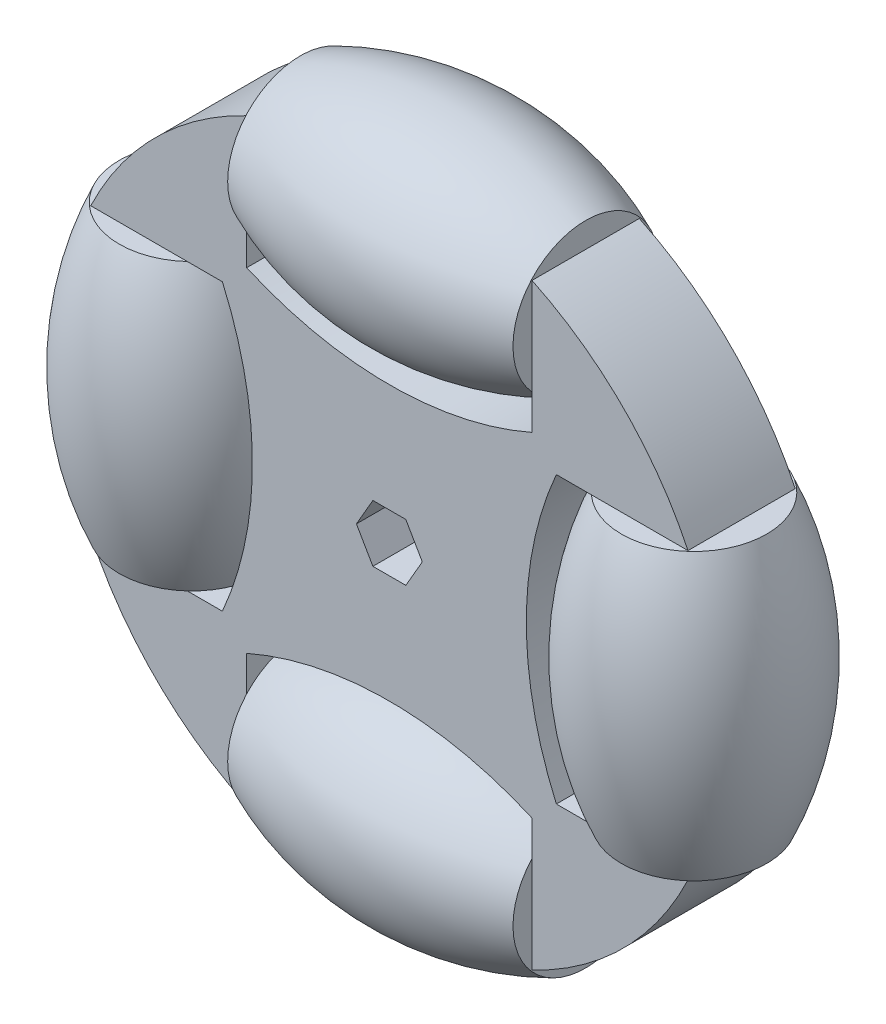
ISO-10303-21;
HEADER;
FILE_DESCRIPTION(('STEP AP214'),'2;1');
FILE_NAME('part.step','',(''),(''),'','','');
FILE_SCHEMA(('AUTOMOTIVE_DESIGN { 1 0 10303 214 1 1 1 1 }'));
ENDSEC;
DATA;
#1=APPLICATION_CONTEXT('core data for automotive mechanical design processes');
#2=APPLICATION_PROTOCOL_DEFINITION('international standard','automotive_design',2000,#1);
#3=PRODUCT_CONTEXT('',#1,'mechanical');
#4=PRODUCT('Part','Part','',(#3));
#5=PRODUCT_RELATED_PRODUCT_CATEGORY('part','',(#4));
#6=PRODUCT_DEFINITION_FORMATION('','',#4);
#7=PRODUCT_DEFINITION_CONTEXT('part definition',#1,'design');
#8=PRODUCT_DEFINITION('design','',#6,#7);
#9=PRODUCT_DEFINITION_SHAPE('','',#8);
#10=(LENGTH_UNIT() NAMED_UNIT(*) SI_UNIT(.MILLI.,.METRE.));
#11=(NAMED_UNIT(*) PLANE_ANGLE_UNIT() SI_UNIT($,.RADIAN.));
#12=(NAMED_UNIT(*) SI_UNIT($,.STERADIAN.) SOLID_ANGLE_UNIT());
#13=UNCERTAINTY_MEASURE_WITH_UNIT(LENGTH_MEASURE(1.E-05),#10,'distance_accuracy_value','');
#14=(GEOMETRIC_REPRESENTATION_CONTEXT(3) GLOBAL_UNCERTAINTY_ASSIGNED_CONTEXT((#13)) GLOBAL_UNIT_ASSIGNED_CONTEXT((#10,
#11,#12)) REPRESENTATION_CONTEXT('',''));
#15=CARTESIAN_POINT('',(0.,0.,0.));
#16=DIRECTION('',(0.,0.,1.));
#17=DIRECTION('',(1.,0.,0.));
#18=AXIS2_PLACEMENT_3D('',#15,#16,#17);
#19=CARTESIAN_POINT('',(-1.44337567297407,2.5,4.7));
#20=DIRECTION('',(0.866025403784439,-0.5,0.));
#21=DIRECTION('',(0.5,0.866025403784439,0.));
#22=AXIS2_PLACEMENT_3D('',#19,#20,#21);
#23=PLANE('',#22);
#24=DIRECTION('',(0.,0.,-1.));
#25=VECTOR('',#24,1.);
#26=CARTESIAN_POINT('',(-2.88675134594813,0.,4.7));
#27=LINE('',#26,#25);
#28=CARTESIAN_POINT('',(-2.88675134594813,0.,4.7));
#29=VERTEX_POINT('',#28);
#30=CARTESIAN_POINT('',(-2.88675134594813,0.,-3.4));
#31=VERTEX_POINT('',#30);
#32=EDGE_CURVE('P0_E11',#29,#31,#27,.T.);
#33=ORIENTED_EDGE('',*,*,#32,.T.);
#34=DIRECTION('',(0.5,0.866025403784439,0.));
#35=VECTOR('',#34,1.);
#36=CARTESIAN_POINT('',(-1.44337567297407,2.5,-3.4));
#37=LINE('',#36,#35);
#38=CARTESIAN_POINT('',(-1.44337567297407,2.5,-3.4));
#39=VERTEX_POINT('',#38);
#40=EDGE_CURVE('P0_E24',#31,#39,#37,.T.);
#41=ORIENTED_EDGE('',*,*,#40,.T.);
#42=DIRECTION('',(0.,0.,-1.));
#43=VECTOR('',#42,1.);
#44=CARTESIAN_POINT('',(-1.44337567297407,2.5,4.7));
#45=LINE('',#44,#43);
#46=CARTESIAN_POINT('',(-1.44337567297407,2.5,4.7));
#47=VERTEX_POINT('',#46);
#48=EDGE_CURVE('P0_E290',#47,#39,#45,.T.);
#49=ORIENTED_EDGE('',*,*,#48,.F.);
#50=DIRECTION('',(-0.5,-0.866025403784439,0.));
#51=VECTOR('',#50,1.);
#52=CARTESIAN_POINT('',(-1.44337567297407,2.5,4.7));
#53=LINE('',#52,#51);
#54=EDGE_CURVE('P0_E288',#47,#29,#53,.T.);
#55=ORIENTED_EDGE('',*,*,#54,.T.);
#56=EDGE_LOOP('',(#33,#41,#49,#55));
#57=FACE_BOUND('',#56,.T.);
#58=ADVANCED_FACE('P0_F17',(#57),#23,.T.);
#59=CARTESIAN_POINT('',(-2.88675134594813,0.,4.7));
#60=DIRECTION('',(0.866025403784439,0.5,0.));
#61=DIRECTION('',(-0.5,0.866025403784439,0.));
#62=AXIS2_PLACEMENT_3D('',#59,#60,#61);
#63=PLANE('',#62);
#64=DIRECTION('',(0.,0.,-1.));
#65=VECTOR('',#64,1.);
#66=CARTESIAN_POINT('',(-1.44337567297406,-2.5,4.7));
#67=LINE('',#66,#65);
#68=CARTESIAN_POINT('',(-1.44337567297406,-2.5,4.7));
#69=VERTEX_POINT('',#68);
#70=CARTESIAN_POINT('',(-1.44337567297406,-2.5,-3.4));
#71=VERTEX_POINT('',#70);
#72=EDGE_CURVE('P0_E286',#69,#71,#67,.T.);
#73=ORIENTED_EDGE('',*,*,#72,.T.);
#74=DIRECTION('',(-0.5,0.866025403784439,0.));
#75=VECTOR('',#74,1.);
#76=CARTESIAN_POINT('',(-2.88675134594813,0.,-3.4));
#77=LINE('',#76,#75);
#78=EDGE_CURVE('P0_E284',#71,#31,#77,.T.);
#79=ORIENTED_EDGE('',*,*,#78,.T.);
#80=ORIENTED_EDGE('',*,*,#32,.F.);
#81=DIRECTION('',(0.5,-0.866025403784439,0.));
#82=VECTOR('',#81,1.);
#83=CARTESIAN_POINT('',(-2.88675134594813,0.,4.7));
#84=LINE('',#83,#82);
#85=EDGE_CURVE('P0_E282',#29,#69,#84,.T.);
#86=ORIENTED_EDGE('',*,*,#85,.T.);
#87=EDGE_LOOP('',(#73,#79,#80,#86));
#88=FACE_BOUND('',#87,.T.);
#89=ADVANCED_FACE('P0_F314',(#88),#63,.T.);
#90=CARTESIAN_POINT('',(-1.44337567297406,-2.5,4.7));
#91=DIRECTION('',(0.,1.,0.));
#92=DIRECTION('',(0.,0.,1.));
#93=AXIS2_PLACEMENT_3D('',#90,#91,#92);
#94=PLANE('',#93);
#95=DIRECTION('',(0.,0.,-1.));
#96=VECTOR('',#95,1.);
#97=CARTESIAN_POINT('',(1.44337567297406,-2.5,4.7));
#98=LINE('',#97,#96);
#99=CARTESIAN_POINT('',(1.44337567297406,-2.5,4.7));
#100=VERTEX_POINT('',#99);
#101=CARTESIAN_POINT('',(1.44337567297406,-2.5,-3.4));
#102=VERTEX_POINT('',#101);
#103=EDGE_CURVE('P0_E280',#100,#102,#98,.T.);
#104=ORIENTED_EDGE('',*,*,#103,.T.);
#105=DIRECTION('',(-1.,0.,0.));
#106=VECTOR('',#105,1.);
#107=CARTESIAN_POINT('',(-1.44337567297406,-2.5,-3.4));
#108=LINE('',#107,#106);
#109=EDGE_CURVE('P0_E277',#102,#71,#108,.T.);
#110=ORIENTED_EDGE('',*,*,#109,.T.);
#111=ORIENTED_EDGE('',*,*,#72,.F.);
#112=DIRECTION('',(1.,0.,0.));
#113=VECTOR('',#112,1.);
#114=CARTESIAN_POINT('',(-1.44337567297406,-2.5,4.7));
#115=LINE('',#114,#113);
#116=EDGE_CURVE('P0_E275',#69,#100,#115,.T.);
#117=ORIENTED_EDGE('',*,*,#116,.T.);
#118=EDGE_LOOP('',(#104,#110,#111,#117));
#119=FACE_BOUND('',#118,.T.);
#120=ADVANCED_FACE('P0_F317',(#119),#94,.T.);
#121=CARTESIAN_POINT('',(1.44337567297406,-2.5,4.7));
#122=DIRECTION('',(-0.866025403784439,0.5,0.));
#123=DIRECTION('',(-0.5,-0.866025403784439,0.));
#124=AXIS2_PLACEMENT_3D('',#121,#122,#123);
#125=PLANE('',#124);
#126=DIRECTION('',(0.,0.,-1.));
#127=VECTOR('',#126,1.);
#128=CARTESIAN_POINT('',(2.88675134594813,0.,4.7));
#129=LINE('',#128,#127);
#130=CARTESIAN_POINT('',(2.88675134594813,0.,4.7));
#131=VERTEX_POINT('',#130);
#132=CARTESIAN_POINT('',(2.88675134594813,0.,-3.4));
#133=VERTEX_POINT('',#132);
#134=EDGE_CURVE('P0_E273',#131,#133,#129,.T.);
#135=ORIENTED_EDGE('',*,*,#134,.T.);
#136=DIRECTION('',(-0.5,-0.866025403784439,0.));
#137=VECTOR('',#136,1.);
#138=CARTESIAN_POINT('',(1.44337567297406,-2.5,-3.4));
#139=LINE('',#138,#137);
#140=EDGE_CURVE('P0_E270',#133,#102,#139,.T.);
#141=ORIENTED_EDGE('',*,*,#140,.T.);
#142=ORIENTED_EDGE('',*,*,#103,.F.);
#143=DIRECTION('',(0.5,0.866025403784439,0.));
#144=VECTOR('',#143,1.);
#145=CARTESIAN_POINT('',(1.44337567297406,-2.5,4.7));
#146=LINE('',#145,#144);
#147=EDGE_CURVE('P0_E268',#100,#131,#146,.T.);
#148=ORIENTED_EDGE('',*,*,#147,.T.);
#149=EDGE_LOOP('',(#135,#141,#142,#148));
#150=FACE_BOUND('',#149,.T.);
#151=ADVANCED_FACE('P0_F320',(#150),#125,.T.);
#152=CARTESIAN_POINT('',(2.88675134594813,0.,4.7));
#153=DIRECTION('',(-0.866025403784439,-0.5,0.));
#154=DIRECTION('',(0.5,-0.866025403784439,0.));
#155=AXIS2_PLACEMENT_3D('',#152,#153,#154);
#156=PLANE('',#155);
#157=DIRECTION('',(0.,0.,-1.));
#158=VECTOR('',#157,1.);
#159=CARTESIAN_POINT('',(1.44337567297406,2.5,4.7));
#160=LINE('',#159,#158);
#161=CARTESIAN_POINT('',(1.44337567297406,2.5,4.7));
#162=VERTEX_POINT('',#161);
#163=CARTESIAN_POINT('',(1.44337567297406,2.5,-3.4));
#164=VERTEX_POINT('',#163);
#165=EDGE_CURVE('P0_E266',#162,#164,#160,.T.);
#166=ORIENTED_EDGE('',*,*,#165,.T.);
#167=DIRECTION('',(0.5,-0.866025403784439,0.));
#168=VECTOR('',#167,1.);
#169=CARTESIAN_POINT('',(2.88675134594813,0.,-3.4));
#170=LINE('',#169,#168);
#171=EDGE_CURVE('P0_E263',#164,#133,#170,.T.);
#172=ORIENTED_EDGE('',*,*,#171,.T.);
#173=ORIENTED_EDGE('',*,*,#134,.F.);
#174=DIRECTION('',(-0.5,0.866025403784439,0.));
#175=VECTOR('',#174,1.);
#176=CARTESIAN_POINT('',(2.88675134594813,0.,4.7));
#177=LINE('',#176,#175);
#178=EDGE_CURVE('P0_E261',#131,#162,#177,.T.);
#179=ORIENTED_EDGE('',*,*,#178,.T.);
#180=EDGE_LOOP('',(#166,#172,#173,#179));
#181=FACE_BOUND('',#180,.T.);
#182=ADVANCED_FACE('P0_F306',(#181),#156,.T.);
#183=CARTESIAN_POINT('',(1.44337567297406,2.5,4.7));
#184=DIRECTION('',(0.,-1.,0.));
#185=DIRECTION('',(1.,0.,0.));
#186=AXIS2_PLACEMENT_3D('',#183,#184,#185);
#187=PLANE('',#186);
#188=ORIENTED_EDGE('',*,*,#48,.T.);
#189=DIRECTION('',(1.,0.,0.));
#190=VECTOR('',#189,1.);
#191=CARTESIAN_POINT('',(1.44337567297406,2.5,-3.4));
#192=LINE('',#191,#190);
#193=EDGE_CURVE('P0_E258',#39,#164,#192,.T.);
#194=ORIENTED_EDGE('',*,*,#193,.T.);
#195=ORIENTED_EDGE('',*,*,#165,.F.);
#196=DIRECTION('',(-1.,0.,0.));
#197=VECTOR('',#196,1.);
#198=CARTESIAN_POINT('',(1.44337567297406,2.5,4.7));
#199=LINE('',#198,#197);
#200=EDGE_CURVE('P0_E255',#162,#47,#199,.T.);
#201=ORIENTED_EDGE('',*,*,#200,.T.);
#202=EDGE_LOOP('',(#188,#194,#195,#201));
#203=FACE_BOUND('',#202,.T.);
#204=ADVANCED_FACE('P0_F293',(#203),#187,.T.);
#205=CARTESIAN_POINT('',(0.,0.,4.7));
#206=DIRECTION('',(0.,0.,-1.));
#207=DIRECTION('',(-1.,0.,0.));
#208=AXIS2_PLACEMENT_3D('',#205,#206,#207);
#209=CYLINDRICAL_SURFACE('',#208,29.);
#210=CARTESIAN_POINT('',(0.,0.,-4.7));
#211=DIRECTION('',(0.,0.,1.));
#212=DIRECTION('',(1.,0.,0.));
#213=AXIS2_PLACEMENT_3D('',#210,#211,#212);
#214=CIRCLE('',#213,29.);
#215=CARTESIAN_POINT('',(-26.1677282162592,-12.4999999999998,-4.7));
#216=VERTEX_POINT('',#215);
#217=CARTESIAN_POINT('',(-12.5000000000002,-26.167728216259,-4.7));
#218=VERTEX_POINT('',#217);
#219=EDGE_CURVE('P0_E249',#216,#218,#214,.T.);
#220=ORIENTED_EDGE('',*,*,#219,.T.);
#221=DIRECTION('',(0.,0.,-1.));
#222=VECTOR('',#221,1.);
#223=CARTESIAN_POINT('',(-12.5000000000002,-26.167728216259,4.7));
#224=LINE('',#223,#222);
#225=CARTESIAN_POINT('',(-12.5000000000002,-26.167728216259,4.7));
#226=VERTEX_POINT('',#225);
#227=EDGE_CURVE('P0_E247',#218,#226,#224,.F.);
#228=ORIENTED_EDGE('',*,*,#227,.T.);
#229=CARTESIAN_POINT('',(0.,0.,4.7));
#230=DIRECTION('',(0.,0.,1.));
#231=DIRECTION('',(1.,0.,0.));
#232=AXIS2_PLACEMENT_3D('',#229,#230,#231);
#233=CIRCLE('',#232,29.);
#234=CARTESIAN_POINT('',(-26.1677282162592,-12.4999999999998,4.7));
#235=VERTEX_POINT('',#234);
#236=EDGE_CURVE('P0_E245',#235,#226,#233,.T.);
#237=ORIENTED_EDGE('',*,*,#236,.F.);
#238=DIRECTION('',(0.,0.,-1.));
#239=VECTOR('',#238,1.);
#240=CARTESIAN_POINT('',(-26.1677282162592,-12.4999999999998,4.7));
#241=LINE('',#240,#239);
#242=EDGE_CURVE('P0_E243',#235,#216,#241,.T.);
#243=ORIENTED_EDGE('',*,*,#242,.T.);
#244=EDGE_LOOP('',(#220,#228,#237,#243));
#245=FACE_BOUND('',#244,.T.);
#246=ADVANCED_FACE('P0_F365',(#245),#209,.T.);
#247=CARTESIAN_POINT('',(12.4999999999998,-26.1677282162591,4.7));
#248=VERTEX_POINT('',#247);
#249=CARTESIAN_POINT('',(26.167728216259,-12.5000000000001,4.7));
#250=VERTEX_POINT('',#249);
#251=EDGE_CURVE('P0_E242',#248,#250,#233,.T.);
#252=ORIENTED_EDGE('',*,*,#251,.F.);
#253=DIRECTION('',(0.,0.,-1.));
#254=VECTOR('',#253,1.);
#255=CARTESIAN_POINT('',(12.4999999999998,-26.1677282162591,4.7));
#256=LINE('',#255,#254);
#257=CARTESIAN_POINT('',(12.4999999999998,-26.1677282162591,-4.7));
#258=VERTEX_POINT('',#257);
#259=EDGE_CURVE('P0_E240',#248,#258,#256,.T.);
#260=ORIENTED_EDGE('',*,*,#259,.T.);
#261=CARTESIAN_POINT('',(26.167728216259,-12.5000000000001,-4.7));
#262=VERTEX_POINT('',#261);
#263=EDGE_CURVE('P0_E169',#258,#262,#214,.T.);
#264=ORIENTED_EDGE('',*,*,#263,.T.);
#265=DIRECTION('',(0.,0.,-1.));
#266=VECTOR('',#265,1.);
#267=CARTESIAN_POINT('',(26.167728216259,-12.5000000000001,4.7));
#268=LINE('',#267,#266);
#269=EDGE_CURVE('P0_E238',#262,#250,#268,.F.);
#270=ORIENTED_EDGE('',*,*,#269,.T.);
#271=EDGE_LOOP('',(#252,#260,#264,#270));
#272=FACE_BOUND('',#271,.T.);
#273=ADVANCED_FACE('P0_F374',(#272),#209,.T.);
#274=CARTESIAN_POINT('',(-12.5,26.1677282162591,-4.7));
#275=VERTEX_POINT('',#274);
#276=CARTESIAN_POINT('',(-26.1677282162589,12.5000000000002,-4.7));
#277=VERTEX_POINT('',#276);
#278=EDGE_CURVE('P0_E237',#275,#277,#214,.T.);
#279=ORIENTED_EDGE('',*,*,#278,.T.);
#280=DIRECTION('',(0.,0.,-1.));
#281=VECTOR('',#280,1.);
#282=CARTESIAN_POINT('',(-26.1677282162589,12.5000000000002,4.7));
#283=LINE('',#282,#281);
#284=CARTESIAN_POINT('',(-26.1677282162589,12.5000000000002,4.7));
#285=VERTEX_POINT('',#284);
#286=EDGE_CURVE('P0_E235',#277,#285,#283,.F.);
#287=ORIENTED_EDGE('',*,*,#286,.T.);
#288=CARTESIAN_POINT('',(-12.5,26.1677282162591,4.7));
#289=VERTEX_POINT('',#288);
#290=EDGE_CURVE('P0_E234',#289,#285,#233,.T.);
#291=ORIENTED_EDGE('',*,*,#290,.F.);
#292=DIRECTION('',(0.,0.,-1.));
#293=VECTOR('',#292,1.);
#294=CARTESIAN_POINT('',(-12.5,26.1677282162591,4.7));
#295=LINE('',#294,#293);
#296=EDGE_CURVE('P0_E232',#289,#275,#295,.T.);
#297=ORIENTED_EDGE('',*,*,#296,.T.);
#298=EDGE_LOOP('',(#279,#287,#291,#297));
#299=FACE_BOUND('',#298,.T.);
#300=ADVANCED_FACE('P0_F385',(#299),#209,.T.);
#301=CARTESIAN_POINT('',(0.,0.,4.7));
#302=DIRECTION('',(0.,0.,1.));
#303=DIRECTION('',(1.,0.,0.));
#304=AXIS2_PLACEMENT_3D('',#301,#302,#303);
#305=PLANE('',#304);
#306=DIRECTION('',(0.,-1.,0.));
#307=VECTOR('',#306,1.);
#308=CARTESIAN_POINT('',(-12.5000000000002,-28.3681159050085,4.7));
#309=LINE('',#308,#307);
#310=CARTESIAN_POINT('',(-12.5,-14.6318840949914,4.7));
#311=VERTEX_POINT('',#310);
#312=EDGE_CURVE('P0_E229',#311,#226,#309,.T.);
#313=ORIENTED_EDGE('',*,*,#312,.F.);
#314=CARTESIAN_POINT('',(0.,-43.,4.7));
#315=DIRECTION('',(0.,0.,1.));
#316=DIRECTION('',(-1.,0.,0.));
#317=AXIS2_PLACEMENT_3D('',#314,#315,#316);
#318=CIRCLE('',#317,31.);
#319=CARTESIAN_POINT('',(12.5,-14.6318840949914,4.7));
#320=VERTEX_POINT('',#319);
#321=EDGE_CURVE('P0_E227',#320,#311,#318,.T.);
#322=ORIENTED_EDGE('',*,*,#321,.F.);
#323=DIRECTION('',(0.,1.,0.));
#324=VECTOR('',#323,1.);
#325=CARTESIAN_POINT('',(12.4999999999998,-28.3681159050087,4.7));
#326=LINE('',#325,#324);
#327=EDGE_CURVE('P0_E180',#248,#320,#326,.T.);
#328=ORIENTED_EDGE('',*,*,#327,.F.);
#329=ORIENTED_EDGE('',*,*,#251,.T.);
#330=DIRECTION('',(1.,0.,0.));
#331=VECTOR('',#330,1.);
#332=CARTESIAN_POINT('',(28.3681159050085,-12.5000000000001,4.7));
#333=LINE('',#332,#331);
#334=CARTESIAN_POINT('',(14.6318840949914,-12.5,4.7));
#335=VERTEX_POINT('',#334);
#336=EDGE_CURVE('P0_E223',#335,#250,#333,.T.);
#337=ORIENTED_EDGE('',*,*,#336,.F.);
#338=CARTESIAN_POINT('',(43.,0.,4.7));
#339=DIRECTION('',(0.,0.,1.));
#340=DIRECTION('',(-1.,0.,0.));
#341=AXIS2_PLACEMENT_3D('',#338,#339,#340);
#342=CIRCLE('',#341,31.);
#343=CARTESIAN_POINT('',(14.6318840949914,12.5,4.7));
#344=VERTEX_POINT('',#343);
#345=EDGE_CURVE('P0_E220',#344,#335,#342,.T.);
#346=ORIENTED_EDGE('',*,*,#345,.F.);
#347=DIRECTION('',(-1.,0.,0.));
#348=VECTOR('',#347,1.);
#349=CARTESIAN_POINT('',(28.3681159050086,12.4999999999999,4.7));
#350=LINE('',#349,#348);
#351=CARTESIAN_POINT('',(26.1677282162591,12.4999999999999,4.7));
#352=VERTEX_POINT('',#351);
#353=EDGE_CURVE('P0_E217',#352,#344,#350,.T.);
#354=ORIENTED_EDGE('',*,*,#353,.F.);
#355=CARTESIAN_POINT('',(12.5,26.1677282162591,4.7));
#356=VERTEX_POINT('',#355);
#357=EDGE_CURVE('P0_E216',#352,#356,#233,.T.);
#358=ORIENTED_EDGE('',*,*,#357,.T.);
#359=DIRECTION('',(0.,1.,0.));
#360=VECTOR('',#359,1.);
#361=CARTESIAN_POINT('',(12.5,28.3681159050086,4.7));
#362=LINE('',#361,#360);
#363=CARTESIAN_POINT('',(12.5,14.6318840949914,4.7));
#364=VERTEX_POINT('',#363);
#365=EDGE_CURVE('P0_E213',#364,#356,#362,.T.);
#366=ORIENTED_EDGE('',*,*,#365,.F.);
#367=CARTESIAN_POINT('',(0.,43.,4.7));
#368=DIRECTION('',(0.,0.,1.));
#369=DIRECTION('',(-1.,0.,0.));
#370=AXIS2_PLACEMENT_3D('',#367,#368,#369);
#371=CIRCLE('',#370,31.);
#372=CARTESIAN_POINT('',(-12.5,14.6318840949914,4.7));
#373=VERTEX_POINT('',#372);
#374=EDGE_CURVE('P0_E210',#373,#364,#371,.T.);
#375=ORIENTED_EDGE('',*,*,#374,.F.);
#376=DIRECTION('',(0.,-1.,0.));
#377=VECTOR('',#376,1.);
#378=CARTESIAN_POINT('',(-12.5,28.3681159050086,4.7));
#379=LINE('',#378,#377);
#380=EDGE_CURVE('P0_E207',#289,#373,#379,.T.);
#381=ORIENTED_EDGE('',*,*,#380,.F.);
#382=ORIENTED_EDGE('',*,*,#290,.T.);
#383=DIRECTION('',(-1.,0.,0.));
#384=VECTOR('',#383,1.);
#385=CARTESIAN_POINT('',(-28.3681159050084,12.5000000000003,4.7));
#386=LINE('',#385,#384);
#387=CARTESIAN_POINT('',(-14.6318840949914,12.5,4.7));
#388=VERTEX_POINT('',#387);
#389=EDGE_CURVE('P0_E204',#388,#285,#386,.T.);
#390=ORIENTED_EDGE('',*,*,#389,.F.);
#391=CARTESIAN_POINT('',(-43.,0.,4.7));
#392=DIRECTION('',(0.,0.,1.));
#393=DIRECTION('',(-1.,0.,0.));
#394=AXIS2_PLACEMENT_3D('',#391,#392,#393);
#395=CIRCLE('',#394,31.);
#396=CARTESIAN_POINT('',(-14.6318840949914,-12.5,4.7));
#397=VERTEX_POINT('',#396);
#398=EDGE_CURVE('P0_E201',#397,#388,#395,.T.);
#399=ORIENTED_EDGE('',*,*,#398,.F.);
#400=DIRECTION('',(1.,0.,0.));
#401=VECTOR('',#400,1.);
#402=CARTESIAN_POINT('',(-28.3681159050087,-12.4999999999997,4.7));
#403=LINE('',#402,#401);
#404=EDGE_CURVE('P0_E193',#235,#397,#403,.T.);
#405=ORIENTED_EDGE('',*,*,#404,.F.);
#406=ORIENTED_EDGE('',*,*,#236,.T.);
#407=EDGE_LOOP('',(#313,#322,#328,#329,#337,#346,#354,#358,#366,#375,#381,#382,#390,#399,#405,#406));
#408=FACE_BOUND('',#407,.T.);
#409=ORIENTED_EDGE('',*,*,#85,.F.);
#410=ORIENTED_EDGE('',*,*,#54,.F.);
#411=ORIENTED_EDGE('',*,*,#200,.F.);
#412=ORIENTED_EDGE('',*,*,#178,.F.);
#413=ORIENTED_EDGE('',*,*,#147,.F.);
#414=ORIENTED_EDGE('',*,*,#116,.F.);
#415=EDGE_LOOP('',(#409,#410,#411,#412,#413,#414));
#416=FACE_BOUND('',#415,.T.);
#417=ADVANCED_FACE('P0_F310',(#408,#416),#305,.T.);
#418=CARTESIAN_POINT('',(0.,0.,-4.7));
#419=DIRECTION('',(0.,0.,1.));
#420=DIRECTION('',(1.,0.,0.));
#421=AXIS2_PLACEMENT_3D('',#418,#419,#420);
#422=PLANE('',#421);
#423=CARTESIAN_POINT('',(0.,0.,-4.7));
#424=DIRECTION('',(0.,0.,-1.));
#425=DIRECTION('',(-1.,0.,0.));
#426=AXIS2_PLACEMENT_3D('',#423,#424,#425);
#427=CIRCLE('',#426,10.6701187189119);
#428=CARTESIAN_POINT('',(-10.6701187189119,0.,-4.7));
#429=VERTEX_POINT('',#428);
#430=EDGE_CURVE('P0_E189',#429,#429,#427,.T.);
#431=ORIENTED_EDGE('',*,*,#430,.F.);
#432=EDGE_LOOP('',(#431));
#433=FACE_BOUND('',#432,.T.);
#434=CARTESIAN_POINT('',(0.,-43.,-4.7));
#435=DIRECTION('',(0.,0.,1.));
#436=DIRECTION('',(-1.,0.,0.));
#437=AXIS2_PLACEMENT_3D('',#434,#435,#436);
#438=CIRCLE('',#437,31.);
#439=CARTESIAN_POINT('',(12.5,-14.6318840949914,-4.7));
#440=VERTEX_POINT('',#439);
#441=CARTESIAN_POINT('',(-12.5,-14.6318840949914,-4.7));
#442=VERTEX_POINT('',#441);
#443=EDGE_CURVE('P0_E166',#440,#442,#438,.T.);
#444=ORIENTED_EDGE('',*,*,#443,.T.);
#445=DIRECTION('',(0.,-1.,0.));
#446=VECTOR('',#445,1.);
#447=CARTESIAN_POINT('',(-12.5000000000002,-28.3681159050085,-4.7));
#448=LINE('',#447,#446);
#449=EDGE_CURVE('P0_E190',#442,#218,#448,.T.);
#450=ORIENTED_EDGE('',*,*,#449,.T.);
#451=ORIENTED_EDGE('',*,*,#219,.F.);
#452=DIRECTION('',(1.,0.,0.));
#453=VECTOR('',#452,1.);
#454=CARTESIAN_POINT('',(-28.3681159050087,-12.4999999999997,-4.7));
#455=LINE('',#454,#453);
#456=CARTESIAN_POINT('',(-14.6318840949914,-12.5,-4.7));
#457=VERTEX_POINT('',#456);
#458=EDGE_CURVE('P0_E195',#216,#457,#455,.T.);
#459=ORIENTED_EDGE('',*,*,#458,.T.);
#460=CARTESIAN_POINT('',(-43.,0.,-4.7));
#461=DIRECTION('',(0.,0.,1.));
#462=DIRECTION('',(-1.,0.,0.));
#463=AXIS2_PLACEMENT_3D('',#460,#461,#462);
#464=CIRCLE('',#463,31.);
#465=CARTESIAN_POINT('',(-14.6318840949914,12.5,-4.7));
#466=VERTEX_POINT('',#465);
#467=EDGE_CURVE('P0_E660',#457,#466,#464,.T.);
#468=ORIENTED_EDGE('',*,*,#467,.T.);
#469=DIRECTION('',(-1.,0.,0.));
#470=VECTOR('',#469,1.);
#471=CARTESIAN_POINT('',(-28.3681159050084,12.5000000000003,-4.7));
#472=LINE('',#471,#470);
#473=EDGE_CURVE('P0_E657',#466,#277,#472,.T.);
#474=ORIENTED_EDGE('',*,*,#473,.T.);
#475=ORIENTED_EDGE('',*,*,#278,.F.);
#476=DIRECTION('',(0.,-1.,0.));
#477=VECTOR('',#476,1.);
#478=CARTESIAN_POINT('',(-12.5,28.3681159050086,-4.7));
#479=LINE('',#478,#477);
#480=CARTESIAN_POINT('',(-12.5,14.6318840949914,-4.7));
#481=VERTEX_POINT('',#480);
#482=EDGE_CURVE('P0_E655',#275,#481,#479,.T.);
#483=ORIENTED_EDGE('',*,*,#482,.T.);
#484=CARTESIAN_POINT('',(0.,43.,-4.7));
#485=DIRECTION('',(0.,0.,1.));
#486=DIRECTION('',(-1.,0.,0.));
#487=AXIS2_PLACEMENT_3D('',#484,#485,#486);
#488=CIRCLE('',#487,31.);
#489=CARTESIAN_POINT('',(12.5,14.6318840949914,-4.7));
#490=VERTEX_POINT('',#489);
#491=EDGE_CURVE('P0_E653',#481,#490,#488,.T.);
#492=ORIENTED_EDGE('',*,*,#491,.T.);
#493=DIRECTION('',(0.,1.,0.));
#494=VECTOR('',#493,1.);
#495=CARTESIAN_POINT('',(12.5,28.3681159050086,-4.7));
#496=LINE('',#495,#494);
#497=CARTESIAN_POINT('',(12.5,26.1677282162591,-4.7));
#498=VERTEX_POINT('',#497);
#499=EDGE_CURVE('P0_E253',#490,#498,#496,.T.);
#500=ORIENTED_EDGE('',*,*,#499,.T.);
#501=CARTESIAN_POINT('',(26.1677282162591,12.4999999999999,-4.7));
#502=VERTEX_POINT('',#501);
#503=EDGE_CURVE('P0_E250',#502,#498,#214,.T.);
#504=ORIENTED_EDGE('',*,*,#503,.F.);
#505=DIRECTION('',(-1.,0.,0.));
#506=VECTOR('',#505,1.);
#507=CARTESIAN_POINT('',(28.3681159050086,12.4999999999999,-4.7));
#508=LINE('',#507,#506);
#509=CARTESIAN_POINT('',(14.6318840949914,12.5,-4.7));
#510=VERTEX_POINT('',#509);
#511=EDGE_CURVE('P0_E254',#502,#510,#508,.T.);
#512=ORIENTED_EDGE('',*,*,#511,.T.);
#513=CARTESIAN_POINT('',(43.,0.,-4.7));
#514=DIRECTION('',(0.,0.,1.));
#515=DIRECTION('',(-1.,0.,0.));
#516=AXIS2_PLACEMENT_3D('',#513,#514,#515);
#517=CIRCLE('',#516,31.);
#518=CARTESIAN_POINT('',(14.6318840949914,-12.5,-4.7));
#519=VERTEX_POINT('',#518);
#520=EDGE_CURVE('P0_E649',#510,#519,#517,.T.);
#521=ORIENTED_EDGE('',*,*,#520,.T.);
#522=DIRECTION('',(1.,0.,0.));
#523=VECTOR('',#522,1.);
#524=CARTESIAN_POINT('',(28.3681159050085,-12.5000000000001,-4.7));
#525=LINE('',#524,#523);
#526=EDGE_CURVE('P0_E172',#519,#262,#525,.T.);
#527=ORIENTED_EDGE('',*,*,#526,.T.);
#528=ORIENTED_EDGE('',*,*,#263,.F.);
#529=DIRECTION('',(0.,1.,0.));
#530=VECTOR('',#529,1.);
#531=CARTESIAN_POINT('',(12.4999999999998,-28.3681159050087,-4.7));
#532=LINE('',#531,#530);
#533=EDGE_CURVE('P0_E161',#258,#440,#532,.T.);
#534=ORIENTED_EDGE('',*,*,#533,.T.);
#535=EDGE_LOOP('',(#444,#450,#451,#459,#468,#474,#475,#483,#492,#500,#504,#512,#521,#527,#528,#534));
#536=FACE_BOUND('',#535,.T.);
#537=ADVANCED_FACE('P0_F163',(#433,#536),#422,.F.);
#538=ORIENTED_EDGE('',*,*,#357,.F.);
#539=DIRECTION('',(0.,0.,-1.));
#540=VECTOR('',#539,1.);
#541=CARTESIAN_POINT('',(26.1677282162591,12.4999999999999,4.7));
#542=LINE('',#541,#540);
#543=EDGE_CURVE('P0_E173',#352,#502,#542,.T.);
#544=ORIENTED_EDGE('',*,*,#543,.T.);
#545=ORIENTED_EDGE('',*,*,#503,.T.);
#546=DIRECTION('',(0.,0.,-1.));
#547=VECTOR('',#546,1.);
#548=CARTESIAN_POINT('',(12.5,26.1677282162591,4.7));
#549=LINE('',#548,#547);
#550=EDGE_CURVE('P0_E643',#498,#356,#549,.F.);
#551=ORIENTED_EDGE('',*,*,#550,.T.);
#552=EDGE_LOOP('',(#538,#544,#545,#551));
#553=FACE_BOUND('',#552,.T.);
#554=ADVANCED_FACE('P0_F377',(#553),#209,.T.);
#555=CARTESIAN_POINT('',(12.5,28.3681159050086,-4.7));
#556=DIRECTION('',(1.,0.,0.));
#557=DIRECTION('',(0.,0.,-1.));
#558=AXIS2_PLACEMENT_3D('',#555,#556,#557);
#559=PLANE('',#558);
#560=ORIENTED_EDGE('',*,*,#499,.F.);
#561=DIRECTION('',(0.,0.,1.));
#562=VECTOR('',#561,1.);
#563=CARTESIAN_POINT('',(12.5,14.6318840949914,-4.7));
#564=LINE('',#563,#562);
#565=EDGE_CURVE('P0_E640',#490,#364,#564,.T.);
#566=ORIENTED_EDGE('',*,*,#565,.T.);
#567=ORIENTED_EDGE('',*,*,#365,.T.);
#568=ORIENTED_EDGE('',*,*,#550,.F.);
#569=EDGE_LOOP('',(#560,#566,#567,#568));
#570=FACE_BOUND('',#569,.T.);
#571=ADVANCED_FACE('P0_F420',(#570),#559,.F.);
#572=CARTESIAN_POINT('',(-12.5,28.3681159050086,-4.7));
#573=DIRECTION('',(-1.,0.,0.));
#574=DIRECTION('',(0.,0.,1.));
#575=AXIS2_PLACEMENT_3D('',#572,#573,#574);
#576=PLANE('',#575);
#577=ORIENTED_EDGE('',*,*,#380,.T.);
#578=DIRECTION('',(0.,0.,1.));
#579=VECTOR('',#578,1.);
#580=CARTESIAN_POINT('',(-12.5,14.6318840949914,-4.7));
#581=LINE('',#580,#579);
#582=EDGE_CURVE('P0_E637',#481,#373,#581,.T.);
#583=ORIENTED_EDGE('',*,*,#582,.F.);
#584=ORIENTED_EDGE('',*,*,#482,.F.);
#585=ORIENTED_EDGE('',*,*,#296,.F.);
#586=EDGE_LOOP('',(#577,#583,#584,#585));
#587=FACE_BOUND('',#586,.T.);
#588=ADVANCED_FACE('P0_F428',(#587),#576,.F.);
#589=CARTESIAN_POINT('',(0.,43.,-4.7));
#590=DIRECTION('',(0.,0.,1.));
#591=DIRECTION('',(1.,0.,0.));
#592=AXIS2_PLACEMENT_3D('',#589,#590,#591);
#593=CYLINDRICAL_SURFACE('',#592,31.);
#594=ORIENTED_EDGE('',*,*,#565,.F.);
#595=ORIENTED_EDGE('',*,*,#491,.F.);
#596=ORIENTED_EDGE('',*,*,#582,.T.);
#597=ORIENTED_EDGE('',*,*,#374,.T.);
#598=EDGE_LOOP('',(#594,#595,#596,#597));
#599=FACE_BOUND('',#598,.T.);
#600=ADVANCED_FACE('P0_F438',(#599),#593,.F.);
#601=CARTESIAN_POINT('',(-28.3681159050084,12.5000000000003,-4.7));
#602=DIRECTION('',(0.,1.,0.));
#603=DIRECTION('',(-1.,0.,0.));
#604=AXIS2_PLACEMENT_3D('',#601,#602,#603);
#605=PLANE('',#604);
#606=ORIENTED_EDGE('',*,*,#473,.F.);
#607=DIRECTION('',(0.,0.,1.));
#608=VECTOR('',#607,1.);
#609=CARTESIAN_POINT('',(-14.6318840949914,12.5,-4.7));
#610=LINE('',#609,#608);
#611=EDGE_CURVE('P0_E634',#466,#388,#610,.T.);
#612=ORIENTED_EDGE('',*,*,#611,.T.);
#613=ORIENTED_EDGE('',*,*,#389,.T.);
#614=ORIENTED_EDGE('',*,*,#286,.F.);
#615=EDGE_LOOP('',(#606,#612,#613,#614));
#616=FACE_BOUND('',#615,.T.);
#617=ADVANCED_FACE('P0_F447',(#616),#605,.F.);
#618=CARTESIAN_POINT('',(-28.3681159050087,-12.4999999999997,-4.7));
#619=DIRECTION('',(0.,-1.,0.));
#620=DIRECTION('',(1.,0.,0.));
#621=AXIS2_PLACEMENT_3D('',#618,#619,#620);
#622=PLANE('',#621);
#623=ORIENTED_EDGE('',*,*,#404,.T.);
#624=DIRECTION('',(0.,0.,1.));
#625=VECTOR('',#624,1.);
#626=CARTESIAN_POINT('',(-14.6318840949914,-12.5,-4.7));
#627=LINE('',#626,#625);
#628=EDGE_CURVE('P0_E631',#457,#397,#627,.T.);
#629=ORIENTED_EDGE('',*,*,#628,.F.);
#630=ORIENTED_EDGE('',*,*,#458,.F.);
#631=ORIENTED_EDGE('',*,*,#242,.F.);
#632=EDGE_LOOP('',(#623,#629,#630,#631));
#633=FACE_BOUND('',#632,.T.);
#634=ADVANCED_FACE('P0_F456',(#633),#622,.F.);
#635=CARTESIAN_POINT('',(-43.,0.,-4.7));
#636=DIRECTION('',(0.,0.,1.));
#637=DIRECTION('',(1.,0.,0.));
#638=AXIS2_PLACEMENT_3D('',#635,#636,#637);
#639=CYLINDRICAL_SURFACE('',#638,31.);
#640=ORIENTED_EDGE('',*,*,#611,.F.);
#641=ORIENTED_EDGE('',*,*,#467,.F.);
#642=ORIENTED_EDGE('',*,*,#628,.T.);
#643=ORIENTED_EDGE('',*,*,#398,.T.);
#644=EDGE_LOOP('',(#640,#641,#642,#643));
#645=FACE_BOUND('',#644,.T.);
#646=ADVANCED_FACE('P0_F465',(#645),#639,.F.);
#647=CARTESIAN_POINT('',(28.3681159050085,-12.5000000000001,-4.7));
#648=DIRECTION('',(0.,-1.,0.));
#649=DIRECTION('',(1.,0.,0.));
#650=AXIS2_PLACEMENT_3D('',#647,#648,#649);
#651=PLANE('',#650);
#652=ORIENTED_EDGE('',*,*,#526,.F.);
#653=DIRECTION('',(0.,0.,1.));
#654=VECTOR('',#653,1.);
#655=CARTESIAN_POINT('',(14.6318840949914,-12.5,-4.7));
#656=LINE('',#655,#654);
#657=EDGE_CURVE('P0_E628',#519,#335,#656,.T.);
#658=ORIENTED_EDGE('',*,*,#657,.T.);
#659=ORIENTED_EDGE('',*,*,#336,.T.);
#660=ORIENTED_EDGE('',*,*,#269,.F.);
#661=EDGE_LOOP('',(#652,#658,#659,#660));
#662=FACE_BOUND('',#661,.T.);
#663=ADVANCED_FACE('P0_F474',(#662),#651,.F.);
#664=CARTESIAN_POINT('',(28.3681159050086,12.4999999999999,-4.7));
#665=DIRECTION('',(0.,1.,0.));
#666=DIRECTION('',(-1.,0.,0.));
#667=AXIS2_PLACEMENT_3D('',#664,#665,#666);
#668=PLANE('',#667);
#669=ORIENTED_EDGE('',*,*,#353,.T.);
#670=DIRECTION('',(0.,0.,1.));
#671=VECTOR('',#670,1.);
#672=CARTESIAN_POINT('',(14.6318840949914,12.5,-4.7));
#673=LINE('',#672,#671);
#674=EDGE_CURVE('P0_E625',#510,#344,#673,.T.);
#675=ORIENTED_EDGE('',*,*,#674,.F.);
#676=ORIENTED_EDGE('',*,*,#511,.F.);
#677=ORIENTED_EDGE('',*,*,#543,.F.);
#678=EDGE_LOOP('',(#669,#675,#676,#677));
#679=FACE_BOUND('',#678,.T.);
#680=ADVANCED_FACE('P0_F483',(#679),#668,.F.);
#681=CARTESIAN_POINT('',(43.,0.,-4.7));
#682=DIRECTION('',(0.,0.,1.));
#683=DIRECTION('',(1.,0.,0.));
#684=AXIS2_PLACEMENT_3D('',#681,#682,#683);
#685=CYLINDRICAL_SURFACE('',#684,31.);
#686=ORIENTED_EDGE('',*,*,#657,.F.);
#687=ORIENTED_EDGE('',*,*,#520,.F.);
#688=ORIENTED_EDGE('',*,*,#674,.T.);
#689=ORIENTED_EDGE('',*,*,#345,.T.);
#690=EDGE_LOOP('',(#686,#687,#688,#689));
#691=FACE_BOUND('',#690,.T.);
#692=ADVANCED_FACE('P0_F492',(#691),#685,.F.);
#693=CARTESIAN_POINT('',(-12.5000000000002,-28.3681159050085,-4.7));
#694=DIRECTION('',(-1.,0.,0.));
#695=DIRECTION('',(0.,-1.,0.));
#696=AXIS2_PLACEMENT_3D('',#693,#694,#695);
#697=PLANE('',#696);
#698=ORIENTED_EDGE('',*,*,#449,.F.);
#699=DIRECTION('',(0.,0.,1.));
#700=VECTOR('',#699,1.);
#701=CARTESIAN_POINT('',(-12.5,-14.6318840949914,-4.7));
#702=LINE('',#701,#700);
#703=EDGE_CURVE('P0_E183',#442,#311,#702,.T.);
#704=ORIENTED_EDGE('',*,*,#703,.T.);
#705=ORIENTED_EDGE('',*,*,#312,.T.);
#706=ORIENTED_EDGE('',*,*,#227,.F.);
#707=EDGE_LOOP('',(#698,#704,#705,#706));
#708=FACE_BOUND('',#707,.T.);
#709=ADVANCED_FACE('P0_F501',(#708),#697,.F.);
#710=CARTESIAN_POINT('',(12.4999999999998,-28.3681159050087,-4.7));
#711=DIRECTION('',(1.,0.,0.));
#712=DIRECTION('',(0.,1.,0.));
#713=AXIS2_PLACEMENT_3D('',#710,#711,#712);
#714=PLANE('',#713);
#715=ORIENTED_EDGE('',*,*,#327,.T.);
#716=DIRECTION('',(0.,0.,1.));
#717=VECTOR('',#716,1.);
#718=CARTESIAN_POINT('',(12.5,-14.6318840949914,-4.7));
#719=LINE('',#718,#717);
#720=EDGE_CURVE('P0_E177',#440,#320,#719,.T.);
#721=ORIENTED_EDGE('',*,*,#720,.F.);
#722=ORIENTED_EDGE('',*,*,#533,.F.);
#723=ORIENTED_EDGE('',*,*,#259,.F.);
#724=EDGE_LOOP('',(#715,#721,#722,#723));
#725=FACE_BOUND('',#724,.T.);
#726=ADVANCED_FACE('P0_F178',(#725),#714,.F.);
#727=CARTESIAN_POINT('',(0.,-43.,-4.7));
#728=DIRECTION('',(0.,0.,1.));
#729=DIRECTION('',(1.,0.,0.));
#730=AXIS2_PLACEMENT_3D('',#727,#728,#729);
#731=CYLINDRICAL_SURFACE('',#730,31.);
#732=ORIENTED_EDGE('',*,*,#703,.F.);
#733=ORIENTED_EDGE('',*,*,#443,.F.);
#734=ORIENTED_EDGE('',*,*,#720,.T.);
#735=ORIENTED_EDGE('',*,*,#321,.T.);
#736=EDGE_LOOP('',(#732,#733,#734,#735));
#737=FACE_BOUND('',#736,.T.);
#738=ADVANCED_FACE('P0_F187',(#737),#731,.F.);
#739=CARTESIAN_POINT('',(0.,0.,-3.4));
#740=DIRECTION('',(0.,0.,-1.));
#741=DIRECTION('',(-1.,0.,0.));
#742=AXIS2_PLACEMENT_3D('',#739,#740,#741);
#743=CYLINDRICAL_SURFACE('',#742,10.6701187189119);
#744=CARTESIAN_POINT('',(0.,0.,-3.4));
#745=DIRECTION('',(0.,0.,-1.));
#746=DIRECTION('',(-1.,0.,0.));
#747=AXIS2_PLACEMENT_3D('',#744,#745,#746);
#748=CIRCLE('',#747,10.6701187189119);
#749=CARTESIAN_POINT('',(-10.6701187189119,0.,-3.4));
#750=VERTEX_POINT('',#749);
#751=EDGE_CURVE('P0_E184',#750,#750,#748,.T.);
#752=ORIENTED_EDGE('',*,*,#751,.F.);
#753=EDGE_LOOP('',(#752));
#754=FACE_BOUND('',#753,.T.);
#755=ORIENTED_EDGE('',*,*,#430,.T.);
#756=EDGE_LOOP('',(#755));
#757=FACE_BOUND('',#756,.T.);
#758=ADVANCED_FACE('P0_F525',(#754,#757),#743,.F.);
#759=CARTESIAN_POINT('',(0.,0.,-3.4));
#760=DIRECTION('',(0.,0.,-1.));
#761=DIRECTION('',(-1.,0.,0.));
#762=AXIS2_PLACEMENT_3D('',#759,#760,#761);
#763=PLANE('',#762);
#764=ORIENTED_EDGE('',*,*,#78,.F.);
#765=ORIENTED_EDGE('',*,*,#109,.F.);
#766=ORIENTED_EDGE('',*,*,#140,.F.);
#767=ORIENTED_EDGE('',*,*,#171,.F.);
#768=ORIENTED_EDGE('',*,*,#193,.F.);
#769=ORIENTED_EDGE('',*,*,#40,.F.);
#770=EDGE_LOOP('',(#764,#765,#766,#767,#768,#769));
#771=FACE_BOUND('',#770,.T.);
#772=ORIENTED_EDGE('',*,*,#751,.T.);
#773=EDGE_LOOP('',(#772));
#774=FACE_BOUND('',#773,.T.);
#775=ADVANCED_FACE('P0_F300',(#771,#774),#763,.T.);
#776=CLOSED_SHELL('',(#58,#89,#120,#151,#182,#204,#246,#273,#300,#417,#537,#554,#571,#588,#600,
#617,#634,#646,#663,#680,#692,#709,#726,#738,#758,#775));
#777=MANIFOLD_SOLID_BREP('P0_B1',#776);
#778=CARTESIAN_POINT('',(0.,22.,0.));
#779=DIRECTION('',(-1.,0.,0.));
#780=DIRECTION('',(0.,0.,1.));
#781=AXIS2_PLACEMENT_3D('',#778,#779,#780);
#782=DEGENERATE_TOROIDAL_SURFACE('',#781,22.,31.,.F.);
#783=CARTESIAN_POINT('',(-12.5,22.,0.));
#784=DIRECTION('',(-1.,0.,0.));
#785=DIRECTION('',(0.,0.,1.));
#786=AXIS2_PLACEMENT_3D('',#783,#784,#785);
#787=CIRCLE('',#786,6.36811590500857);
#788=CARTESIAN_POINT('',(-12.5,22.,6.36811590500857));
#789=VERTEX_POINT('',#788);
#790=EDGE_CURVE('P1_E10',#789,#789,#787,.T.);
#791=ORIENTED_EDGE('',*,*,#790,.F.);
#792=EDGE_LOOP('',(#791));
#793=FACE_BOUND('',#792,.T.);
#794=CARTESIAN_POINT('',(12.5,22.,0.));
#795=DIRECTION('',(-1.,0.,0.));
#796=DIRECTION('',(0.,0.,1.));
#797=AXIS2_PLACEMENT_3D('',#794,#795,#796);
#798=CIRCLE('',#797,6.36811590500857);
#799=CARTESIAN_POINT('',(12.5,22.,6.36811590500857));
#800=VERTEX_POINT('',#799);
#801=EDGE_CURVE('P1_E21',#800,#800,#798,.T.);
#802=ORIENTED_EDGE('',*,*,#801,.T.);
#803=EDGE_LOOP('',(#802));
#804=FACE_BOUND('',#803,.T.);
#805=ADVANCED_FACE('P1_F15',(#793,#804),#782,.F.);
#806=CARTESIAN_POINT('',(-12.5,28.3681159050086,0.));
#807=DIRECTION('',(1.,0.,0.));
#808=DIRECTION('',(0.,0.,-1.));
#809=AXIS2_PLACEMENT_3D('',#806,#807,#808);
#810=PLANE('',#809);
#811=ORIENTED_EDGE('',*,*,#790,.T.);
#812=EDGE_LOOP('',(#811));
#813=FACE_BOUND('',#812,.T.);
#814=ADVANCED_FACE('P1_F30',(#813),#810,.F.);
#815=CARTESIAN_POINT('',(12.5,28.3681159050086,0.));
#816=DIRECTION('',(-1.,0.,0.));
#817=DIRECTION('',(0.,0.,1.));
#818=AXIS2_PLACEMENT_3D('',#815,#816,#817);
#819=PLANE('',#818);
#820=ORIENTED_EDGE('',*,*,#801,.F.);
#821=EDGE_LOOP('',(#820));
#822=FACE_BOUND('',#821,.T.);
#823=ADVANCED_FACE('P1_F28',(#822),#819,.F.);
#824=CLOSED_SHELL('',(#805,#814,#823));
#825=MANIFOLD_SOLID_BREP('P1_B1',#824);
#826=CARTESIAN_POINT('',(22.,0.,0.));
#827=DIRECTION('',(0.,1.,0.));
#828=DIRECTION('',(0.,0.,1.));
#829=AXIS2_PLACEMENT_3D('',#826,#827,#828);
#830=DEGENERATE_TOROIDAL_SURFACE('',#829,22.,31.,.F.);
#831=CARTESIAN_POINT('',(22.,12.4999999999999,0.));
#832=DIRECTION('',(0.,1.,0.));
#833=DIRECTION('',(0.,0.,1.));
#834=AXIS2_PLACEMENT_3D('',#831,#832,#833);
#835=CIRCLE('',#834,6.36811590500857);
#836=CARTESIAN_POINT('',(22.,12.4999999999999,6.36811590500857));
#837=VERTEX_POINT('',#836);
#838=EDGE_CURVE('P2_E10',#837,#837,#835,.T.);
#839=ORIENTED_EDGE('',*,*,#838,.F.);
#840=EDGE_LOOP('',(#839));
#841=FACE_BOUND('',#840,.T.);
#842=CARTESIAN_POINT('',(22.,-12.5000000000001,0.));
#843=DIRECTION('',(0.,1.,0.));
#844=DIRECTION('',(0.,0.,1.));
#845=AXIS2_PLACEMENT_3D('',#842,#843,#844);
#846=CIRCLE('',#845,6.36811590500857);
#847=CARTESIAN_POINT('',(22.,-12.5000000000001,6.36811590500857));
#848=VERTEX_POINT('',#847);
#849=EDGE_CURVE('P2_E21',#848,#848,#846,.T.);
#850=ORIENTED_EDGE('',*,*,#849,.T.);
#851=EDGE_LOOP('',(#850));
#852=FACE_BOUND('',#851,.T.);
#853=ADVANCED_FACE('P2_F15',(#841,#852),#830,.F.);
#854=CARTESIAN_POINT('',(28.3681159050086,12.4999999999999,0.));
#855=DIRECTION('',(0.,-1.,0.));
#856=DIRECTION('',(0.,0.,-1.));
#857=AXIS2_PLACEMENT_3D('',#854,#855,#856);
#858=PLANE('',#857);
#859=ORIENTED_EDGE('',*,*,#838,.T.);
#860=EDGE_LOOP('',(#859));
#861=FACE_BOUND('',#860,.T.);
#862=ADVANCED_FACE('P2_F30',(#861),#858,.F.);
#863=CARTESIAN_POINT('',(28.3681159050085,-12.5000000000001,0.));
#864=DIRECTION('',(0.,1.,0.));
#865=DIRECTION('',(0.,0.,1.));
#866=AXIS2_PLACEMENT_3D('',#863,#864,#865);
#867=PLANE('',#866);
#868=ORIENTED_EDGE('',*,*,#849,.F.);
#869=EDGE_LOOP('',(#868));
#870=FACE_BOUND('',#869,.T.);
#871=ADVANCED_FACE('P2_F28',(#870),#867,.F.);
#872=CLOSED_SHELL('',(#853,#862,#871));
#873=MANIFOLD_SOLID_BREP('P2_B1',#872);
#874=CARTESIAN_POINT('',(0.,-22.,0.));
#875=DIRECTION('',(1.,0.,0.));
#876=DIRECTION('',(0.,0.,1.));
#877=AXIS2_PLACEMENT_3D('',#874,#875,#876);
#878=DEGENERATE_TOROIDAL_SURFACE('',#877,22.,31.,.F.);
#879=CARTESIAN_POINT('',(12.5,-22.,0.));
#880=DIRECTION('',(1.,0.,0.));
#881=DIRECTION('',(0.,0.,1.));
#882=AXIS2_PLACEMENT_3D('',#879,#880,#881);
#883=CIRCLE('',#882,6.36811590500857);
#884=CARTESIAN_POINT('',(12.5,-22.,6.36811590500857));
#885=VERTEX_POINT('',#884);
#886=EDGE_CURVE('P3_E10',#885,#885,#883,.T.);
#887=ORIENTED_EDGE('',*,*,#886,.F.);
#888=EDGE_LOOP('',(#887));
#889=FACE_BOUND('',#888,.T.);
#890=CARTESIAN_POINT('',(-12.5,-22.,0.));
#891=DIRECTION('',(1.,0.,0.));
#892=DIRECTION('',(0.,0.,1.));
#893=AXIS2_PLACEMENT_3D('',#890,#891,#892);
#894=CIRCLE('',#893,6.36811590500857);
#895=CARTESIAN_POINT('',(-12.5,-22.,6.36811590500857));
#896=VERTEX_POINT('',#895);
#897=EDGE_CURVE('P3_E21',#896,#896,#894,.T.);
#898=ORIENTED_EDGE('',*,*,#897,.T.);
#899=EDGE_LOOP('',(#898));
#900=FACE_BOUND('',#899,.T.);
#901=ADVANCED_FACE('P3_F15',(#889,#900),#878,.F.);
#902=CARTESIAN_POINT('',(12.5,-28.3681159050086,0.));
#903=DIRECTION('',(-1.,0.,0.));
#904=DIRECTION('',(0.,0.,-1.));
#905=AXIS2_PLACEMENT_3D('',#902,#903,#904);
#906=PLANE('',#905);
#907=ORIENTED_EDGE('',*,*,#886,.T.);
#908=EDGE_LOOP('',(#907));
#909=FACE_BOUND('',#908,.T.);
#910=ADVANCED_FACE('P3_F30',(#909),#906,.F.);
#911=CARTESIAN_POINT('',(-12.5,-28.3681159050086,0.));
#912=DIRECTION('',(1.,0.,0.));
#913=DIRECTION('',(0.,0.,1.));
#914=AXIS2_PLACEMENT_3D('',#911,#912,#913);
#915=PLANE('',#914);
#916=ORIENTED_EDGE('',*,*,#897,.F.);
#917=EDGE_LOOP('',(#916));
#918=FACE_BOUND('',#917,.T.);
#919=ADVANCED_FACE('P3_F28',(#918),#915,.F.);
#920=CLOSED_SHELL('',(#901,#910,#919));
#921=MANIFOLD_SOLID_BREP('P3_B1',#920);
#922=CARTESIAN_POINT('',(-22.,2.30437768363647E-13,0.));
#923=DIRECTION('',(0.,-1.,0.));
#924=DIRECTION('',(0.,0.,1.));
#925=AXIS2_PLACEMENT_3D('',#922,#923,#924);
#926=DEGENERATE_TOROIDAL_SURFACE('',#925,22.,31.,.F.);
#927=CARTESIAN_POINT('',(-22.0000000000001,-12.4999999999998,0.));
#928=DIRECTION('',(0.,-1.,0.));
#929=DIRECTION('',(0.,0.,1.));
#930=AXIS2_PLACEMENT_3D('',#927,#928,#929);
#931=CIRCLE('',#930,6.36811590500857);
#932=CARTESIAN_POINT('',(-22.0000000000001,-12.4999999999998,6.36811590500857));
#933=VERTEX_POINT('',#932);
#934=EDGE_CURVE('P4_E10',#933,#933,#931,.T.);
#935=ORIENTED_EDGE('',*,*,#934,.F.);
#936=EDGE_LOOP('',(#935));
#937=FACE_BOUND('',#936,.T.);
#938=CARTESIAN_POINT('',(-21.9999999999999,12.5000000000002,0.));
#939=DIRECTION('',(0.,-1.,0.));
#940=DIRECTION('',(0.,0.,1.));
#941=AXIS2_PLACEMENT_3D('',#938,#939,#940);
#942=CIRCLE('',#941,6.36811590500857);
#943=CARTESIAN_POINT('',(-21.9999999999999,12.5000000000002,6.36811590500857));
#944=VERTEX_POINT('',#943);
#945=EDGE_CURVE('P4_E21',#944,#944,#942,.T.);
#946=ORIENTED_EDGE('',*,*,#945,.T.);
#947=EDGE_LOOP('',(#946));
#948=FACE_BOUND('',#947,.T.);
#949=ADVANCED_FACE('P4_F15',(#937,#948),#926,.F.);
#950=CARTESIAN_POINT('',(-28.3681159050087,-12.4999999999997,0.));
#951=DIRECTION('',(0.,1.,0.));
#952=DIRECTION('',(0.,0.,-1.));
#953=AXIS2_PLACEMENT_3D('',#950,#951,#952);
#954=PLANE('',#953);
#955=ORIENTED_EDGE('',*,*,#934,.T.);
#956=EDGE_LOOP('',(#955));
#957=FACE_BOUND('',#956,.T.);
#958=ADVANCED_FACE('P4_F30',(#957),#954,.F.);
#959=CARTESIAN_POINT('',(-28.3681159050084,12.5000000000003,0.));
#960=DIRECTION('',(0.,-1.,0.));
#961=DIRECTION('',(0.,0.,1.));
#962=AXIS2_PLACEMENT_3D('',#959,#960,#961);
#963=PLANE('',#962);
#964=ORIENTED_EDGE('',*,*,#945,.F.);
#965=EDGE_LOOP('',(#964));
#966=FACE_BOUND('',#965,.T.);
#967=ADVANCED_FACE('P4_F28',(#966),#963,.F.);
#968=CLOSED_SHELL('',(#949,#958,#967));
#969=MANIFOLD_SOLID_BREP('P4_B1',#968);
#970=ADVANCED_BREP_SHAPE_REPRESENTATION('',(#18,#777,#825,#873,#921,#969),#14);
#971=SHAPE_DEFINITION_REPRESENTATION(#9,#970);
ENDSEC;
END-ISO-10303-21;
